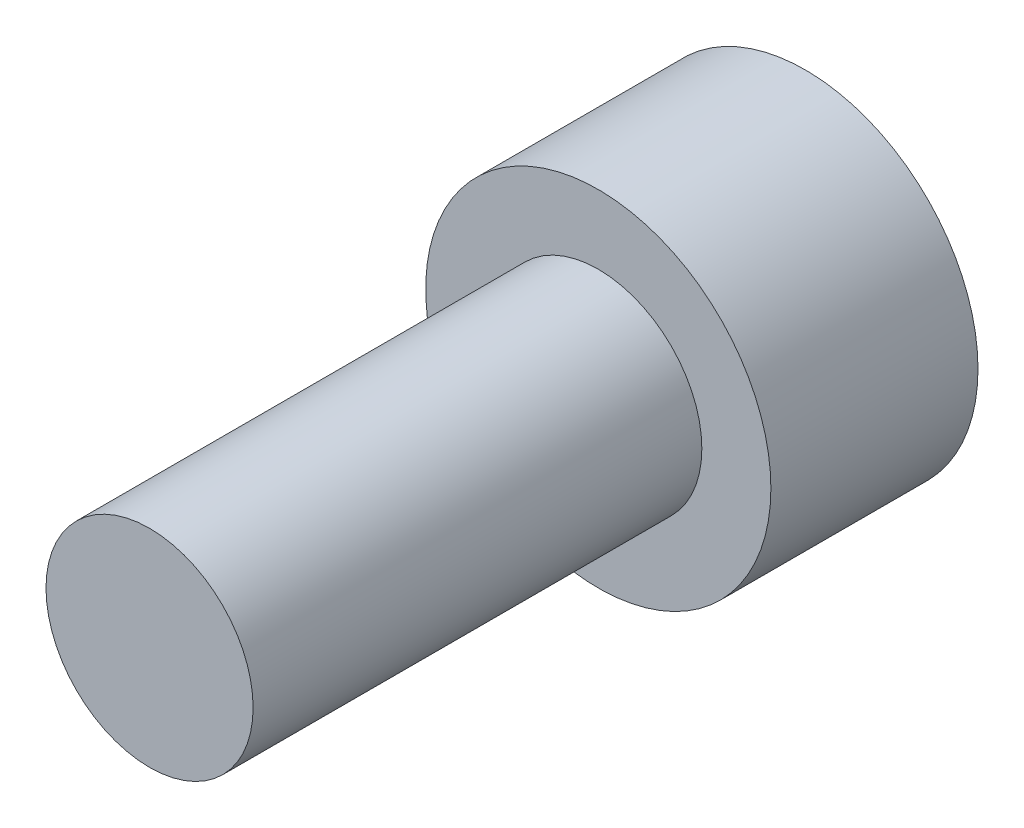
ISO-10303-21;
HEADER;
FILE_DESCRIPTION(('STEP AP214'),'2;1');
FILE_NAME('part.step','',(''),(''),'','','');
FILE_SCHEMA(('AUTOMOTIVE_DESIGN { 1 0 10303 214 1 1 1 1 }'));
ENDSEC;
DATA;
#1=APPLICATION_CONTEXT('core data for automotive mechanical design processes');
#2=APPLICATION_PROTOCOL_DEFINITION('international standard','automotive_design',2000,#1);
#3=PRODUCT_CONTEXT('',#1,'mechanical');
#4=PRODUCT('Part','Part','',(#3));
#5=PRODUCT_RELATED_PRODUCT_CATEGORY('part','',(#4));
#6=PRODUCT_DEFINITION_FORMATION('','',#4);
#7=PRODUCT_DEFINITION_CONTEXT('part definition',#1,'design');
#8=PRODUCT_DEFINITION('design','',#6,#7);
#9=PRODUCT_DEFINITION_SHAPE('','',#8);
#10=(LENGTH_UNIT() NAMED_UNIT(*) SI_UNIT(.MILLI.,.METRE.));
#11=(NAMED_UNIT(*) PLANE_ANGLE_UNIT() SI_UNIT($,.RADIAN.));
#12=(NAMED_UNIT(*) SI_UNIT($,.STERADIAN.) SOLID_ANGLE_UNIT());
#13=UNCERTAINTY_MEASURE_WITH_UNIT(LENGTH_MEASURE(1.E-05),#10,'distance_accuracy_value','');
#14=(GEOMETRIC_REPRESENTATION_CONTEXT(3) GLOBAL_UNCERTAINTY_ASSIGNED_CONTEXT((#13)) GLOBAL_UNIT_ASSIGNED_CONTEXT((#10,
#11,#12)) REPRESENTATION_CONTEXT('',''));
#15=CARTESIAN_POINT('',(0.,0.,0.));
#16=DIRECTION('',(0.,0.,1.));
#17=DIRECTION('',(1.,0.,0.));
#18=AXIS2_PLACEMENT_3D('',#15,#16,#17);
#19=CARTESIAN_POINT('',(0.,0.,6.));
#20=DIRECTION('',(0.,0.,-1.));
#21=DIRECTION('',(-1.,0.,0.));
#22=AXIS2_PLACEMENT_3D('',#19,#20,#21);
#23=CYLINDRICAL_SURFACE('',#22,5.);
#24=CARTESIAN_POINT('',(0.,0.,6.));
#25=DIRECTION('',(0.,0.,1.));
#26=DIRECTION('',(1.,0.,0.));
#27=AXIS2_PLACEMENT_3D('',#24,#25,#26);
#28=CIRCLE('',#27,5.);
#29=CARTESIAN_POINT('',(5.,0.,6.));
#30=VERTEX_POINT('',#29);
#31=EDGE_CURVE('E45',#30,#30,#28,.T.);
#32=ORIENTED_EDGE('',*,*,#31,.F.);
#33=EDGE_LOOP('',(#32));
#34=FACE_BOUND('',#33,.T.);
#35=CARTESIAN_POINT('',(0.,0.,0.));
#36=DIRECTION('',(0.,0.,1.));
#37=DIRECTION('',(1.,0.,0.));
#38=AXIS2_PLACEMENT_3D('',#35,#36,#37);
#39=CIRCLE('',#38,5.);
#40=CARTESIAN_POINT('',(5.,0.,0.));
#41=VERTEX_POINT('',#40);
#42=EDGE_CURVE('E40',#41,#41,#39,.T.);
#43=ORIENTED_EDGE('',*,*,#42,.T.);
#44=EDGE_LOOP('',(#43));
#45=FACE_BOUND('',#44,.T.);
#46=ADVANCED_FACE('F37',(#34,#45),#23,.T.);
#47=CARTESIAN_POINT('',(0.,0.,6.));
#48=DIRECTION('',(0.,0.,1.));
#49=DIRECTION('',(1.,0.,0.));
#50=AXIS2_PLACEMENT_3D('',#47,#48,#49);
#51=PLANE('',#50);
#52=CARTESIAN_POINT('',(0.,0.,6.));
#53=DIRECTION('',(0.,0.,1.));
#54=DIRECTION('',(1.,0.,0.));
#55=AXIS2_PLACEMENT_3D('',#52,#53,#54);
#56=CIRCLE('',#55,3.);
#57=CARTESIAN_POINT('',(-3.,0.,6.));
#58=VERTEX_POINT('',#57);
#59=EDGE_CURVE('E10',#58,#58,#56,.T.);
#60=ORIENTED_EDGE('',*,*,#59,.F.);
#61=EDGE_LOOP('',(#60));
#62=FACE_BOUND('',#61,.T.);
#63=ORIENTED_EDGE('',*,*,#31,.T.);
#64=EDGE_LOOP('',(#63));
#65=FACE_BOUND('',#64,.T.);
#66=ADVANCED_FACE('F65',(#62,#65),#51,.T.);
#67=CARTESIAN_POINT('',(0.,0.,0.));
#68=DIRECTION('',(0.,0.,1.));
#69=DIRECTION('',(1.,0.,0.));
#70=AXIS2_PLACEMENT_3D('',#67,#68,#69);
#71=PLANE('',#70);
#72=ORIENTED_EDGE('',*,*,#42,.F.);
#73=EDGE_LOOP('',(#72));
#74=FACE_BOUND('',#73,.T.);
#75=ADVANCED_FACE('F62',(#74),#71,.F.);
#76=CARTESIAN_POINT('',(0.,0.,19.));
#77=DIRECTION('',(0.,0.,-1.));
#78=DIRECTION('',(-1.,0.,0.));
#79=AXIS2_PLACEMENT_3D('',#76,#77,#78);
#80=CYLINDRICAL_SURFACE('',#79,3.);
#81=CARTESIAN_POINT('',(0.,0.,19.));
#82=DIRECTION('',(0.,0.,1.));
#83=DIRECTION('',(1.,0.,0.));
#84=AXIS2_PLACEMENT_3D('',#81,#82,#83);
#85=CIRCLE('',#84,3.);
#86=CARTESIAN_POINT('',(-3.,0.,19.));
#87=VERTEX_POINT('',#86);
#88=EDGE_CURVE('E52',#87,#87,#85,.T.);
#89=CARTESIAN_POINT('',(-3.,0.,19.));
#90=CARTESIAN_POINT('',(-3.,0.,18.8645833333333));
#91=CARTESIAN_POINT('',(-3.,0.,18.7291666666667));
#92=CARTESIAN_POINT('',(-3.,0.,18.4583333333333));
#93=CARTESIAN_POINT('',(-3.,0.,18.3229166666667));
#94=CARTESIAN_POINT('',(-3.,0.,18.0520833333333));
#95=CARTESIAN_POINT('',(-3.,0.,17.9166666666667));
#96=CARTESIAN_POINT('',(-3.,0.,17.6458333333333));
#97=CARTESIAN_POINT('',(-3.,0.,17.5104166666667));
#98=CARTESIAN_POINT('',(-3.,0.,17.2395833333333));
#99=CARTESIAN_POINT('',(-3.,0.,17.1041666666667));
#100=CARTESIAN_POINT('',(-3.,0.,16.8333333333333));
#101=CARTESIAN_POINT('',(-3.,0.,16.6979166666667));
#102=CARTESIAN_POINT('',(-3.,0.,16.4270833333333));
#103=CARTESIAN_POINT('',(-3.,0.,16.2916666666667));
#104=CARTESIAN_POINT('',(-3.,0.,16.0208333333333));
#105=CARTESIAN_POINT('',(-3.,0.,15.8854166666667));
#106=CARTESIAN_POINT('',(-3.,0.,15.6145833333333));
#107=CARTESIAN_POINT('',(-3.,0.,15.4791666666667));
#108=CARTESIAN_POINT('',(-3.,0.,15.2083333333333));
#109=CARTESIAN_POINT('',(-3.,0.,15.0729166666667));
#110=CARTESIAN_POINT('',(-3.,0.,14.8020833333333));
#111=CARTESIAN_POINT('',(-3.,0.,14.6666666666667));
#112=CARTESIAN_POINT('',(-3.,0.,14.3958333333333));
#113=CARTESIAN_POINT('',(-3.,0.,14.2604166666667));
#114=CARTESIAN_POINT('',(-3.,0.,13.9895833333333));
#115=CARTESIAN_POINT('',(-3.,0.,13.8541666666667));
#116=CARTESIAN_POINT('',(-3.,0.,13.5833333333333));
#117=CARTESIAN_POINT('',(-3.,0.,13.4479166666667));
#118=CARTESIAN_POINT('',(-3.,0.,13.1770833333333));
#119=CARTESIAN_POINT('',(-3.,0.,13.0416666666667));
#120=CARTESIAN_POINT('',(-3.,0.,12.7708333333333));
#121=CARTESIAN_POINT('',(-3.,0.,12.6354166666667));
#122=CARTESIAN_POINT('',(-3.,0.,12.3645833333333));
#123=CARTESIAN_POINT('',(-3.,0.,12.2291666666667));
#124=CARTESIAN_POINT('',(-3.,0.,11.9583333333333));
#125=CARTESIAN_POINT('',(-3.,0.,11.8229166666667));
#126=CARTESIAN_POINT('',(-3.,0.,11.5520833333333));
#127=CARTESIAN_POINT('',(-3.,0.,11.4166666666667));
#128=CARTESIAN_POINT('',(-3.,0.,11.1458333333333));
#129=CARTESIAN_POINT('',(-3.,0.,11.0104166666667));
#130=CARTESIAN_POINT('',(-3.,0.,10.7395833333333));
#131=CARTESIAN_POINT('',(-3.,0.,10.6041666666667));
#132=CARTESIAN_POINT('',(-3.,0.,10.3333333333333));
#133=CARTESIAN_POINT('',(-3.,0.,10.1979166666667));
#134=CARTESIAN_POINT('',(-3.,0.,9.92708333333333));
#135=CARTESIAN_POINT('',(-3.,0.,9.79166666666667));
#136=CARTESIAN_POINT('',(-3.,0.,9.52083333333333));
#137=CARTESIAN_POINT('',(-3.,0.,9.38541666666667));
#138=CARTESIAN_POINT('',(-3.,0.,9.11458333333333));
#139=CARTESIAN_POINT('',(-3.,0.,8.97916666666667));
#140=CARTESIAN_POINT('',(-3.,0.,8.70833333333333));
#141=CARTESIAN_POINT('',(-3.,0.,8.57291666666667));
#142=CARTESIAN_POINT('',(-3.,0.,8.30208333333333));
#143=CARTESIAN_POINT('',(-3.,0.,8.16666666666667));
#144=CARTESIAN_POINT('',(-3.,0.,7.89583333333333));
#145=CARTESIAN_POINT('',(-3.,0.,7.76041666666667));
#146=CARTESIAN_POINT('',(-3.,0.,7.48958333333333));
#147=CARTESIAN_POINT('',(-3.,0.,7.35416666666667));
#148=CARTESIAN_POINT('',(-3.,0.,7.08333333333333));
#149=CARTESIAN_POINT('',(-3.,0.,6.94791666666667));
#150=CARTESIAN_POINT('',(-3.,0.,6.67708333333333));
#151=CARTESIAN_POINT('',(-3.,0.,6.54166666666667));
#152=CARTESIAN_POINT('',(-3.,0.,6.27083333333333));
#153=CARTESIAN_POINT('',(-3.,0.,6.13541666666667));
#154=CARTESIAN_POINT('',(-3.,0.,6.));
#155=B_SPLINE_CURVE_WITH_KNOTS('',3,(#89,#90,#91,#92,#93,#94,#95,#96,#97,#98,#99,#100,#101,#102,
#103,#104,#105,#106,#107,#108,#109,#110,#111,#112,#113,#114,#115,#116,#117,#118,#119,#120,#121,
#122,#123,#124,#125,#126,#127,#128,#129,#130,#131,#132,#133,#134,#135,#136,#137,#138,#139,#140,
#141,#142,#143,#144,#145,#146,#147,#148,#149,#150,#151,#152,#153,#154),.UNSPECIFIED.,.F.,.F.,(4,
2,2,2,2,2,2,2,2,2,2,2,2,2,2,2,2,2,2,2,2,2,2,2,2,2,2,2,2,2,2,2,4),(0.,0.40625,0.812500000000001,
1.21875,1.625,2.03125,2.4375,2.84375,3.25,3.65625,4.0625,4.46875,4.875,5.28125,5.6875,6.09375,
6.5,6.90625,7.3125,7.71875,8.125,8.53125,8.9375,9.34375,9.75,10.15625,10.5625,10.96875,11.375,
11.78125,12.1875,12.59375,13.),.UNSPECIFIED.);
#156=EDGE_CURVE('BSEAM64',#87,#58,#155,.T.);
#157=ORIENTED_EDGE('',*,*,#88,.F.);
#158=ORIENTED_EDGE('',*,*,#59,.T.);
#159=ORIENTED_EDGE('',*,*,#156,.T.);
#160=ORIENTED_EDGE('',*,*,#156,.F.);
#161=EDGE_LOOP('',(#157,#159,#158,#160));
#162=FACE_BOUND('',#161,.T.);
#163=ADVANCED_FACE('F64',(#162),#80,.T.);
#164=CARTESIAN_POINT('',(0.,0.,19.));
#165=DIRECTION('',(0.,0.,1.));
#166=DIRECTION('',(1.,0.,0.));
#167=AXIS2_PLACEMENT_3D('',#164,#165,#166);
#168=PLANE('',#167);
#169=ORIENTED_EDGE('',*,*,#88,.T.);
#170=EDGE_LOOP('',(#169));
#171=FACE_BOUND('',#170,.T.);
#172=ADVANCED_FACE('F70',(#171),#168,.T.);
#173=CLOSED_SHELL('',(#46,#66,#75,#163,#172));
#174=MANIFOLD_SOLID_BREP('B2',#173);
#175=ADVANCED_BREP_SHAPE_REPRESENTATION('',(#18,#174),#14);
#176=SHAPE_DEFINITION_REPRESENTATION(#9,#175);
ENDSEC;
END-ISO-10303-21;
